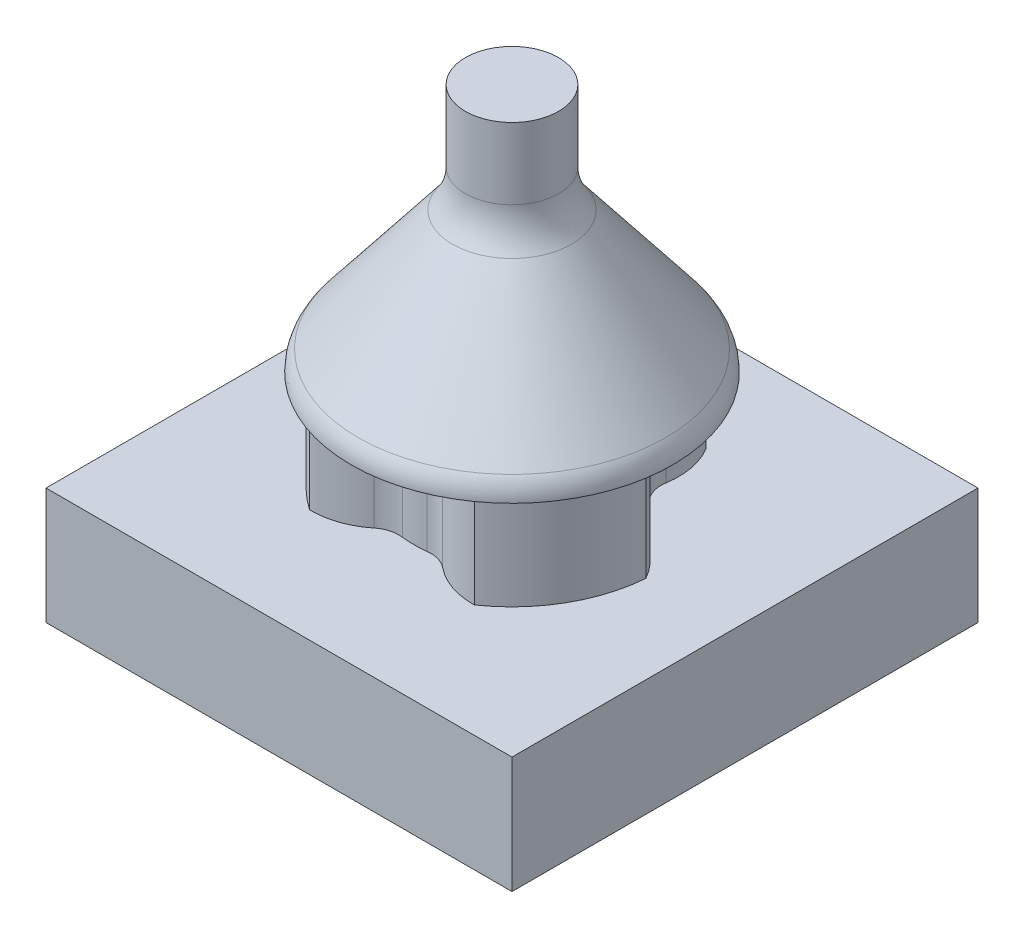
ISO-10303-21;
HEADER;
FILE_DESCRIPTION(('STEP AP214'),'2;1');
FILE_NAME('part.step','',(''),(''),'','','');
FILE_SCHEMA(('AUTOMOTIVE_DESIGN { 1 0 10303 214 1 1 1 1 }'));
ENDSEC;
DATA;
#1=APPLICATION_CONTEXT('core data for automotive mechanical design processes');
#2=APPLICATION_PROTOCOL_DEFINITION('international standard','automotive_design',2000,#1);
#3=PRODUCT_CONTEXT('',#1,'mechanical');
#4=PRODUCT('Part','Part','',(#3));
#5=PRODUCT_RELATED_PRODUCT_CATEGORY('part','',(#4));
#6=PRODUCT_DEFINITION_FORMATION('','',#4);
#7=PRODUCT_DEFINITION_CONTEXT('part definition',#1,'design');
#8=PRODUCT_DEFINITION('design','',#6,#7);
#9=PRODUCT_DEFINITION_SHAPE('','',#8);
#10=(LENGTH_UNIT() NAMED_UNIT(*) SI_UNIT(.MILLI.,.METRE.));
#11=(NAMED_UNIT(*) PLANE_ANGLE_UNIT() SI_UNIT($,.RADIAN.));
#12=(NAMED_UNIT(*) SI_UNIT($,.STERADIAN.) SOLID_ANGLE_UNIT());
#13=UNCERTAINTY_MEASURE_WITH_UNIT(LENGTH_MEASURE(1.E-05),#10,'distance_accuracy_value','');
#14=(GEOMETRIC_REPRESENTATION_CONTEXT(3) GLOBAL_UNCERTAINTY_ASSIGNED_CONTEXT((#13)) GLOBAL_UNIT_ASSIGNED_CONTEXT((#10,
#11,#12)) REPRESENTATION_CONTEXT('',''));
#15=CARTESIAN_POINT('',(0.,0.,0.));
#16=DIRECTION('',(0.,0.,1.));
#17=DIRECTION('',(1.,0.,0.));
#18=AXIS2_PLACEMENT_3D('',#15,#16,#17);
#19=CARTESIAN_POINT('',(0.,0.,0.));
#20=DIRECTION('',(0.,-1.,0.));
#21=DIRECTION('',(0.,0.,-1.));
#22=AXIS2_PLACEMENT_3D('',#19,#20,#21);
#23=PLANE('',#22);
#24=DIRECTION('',(0.,0.,1.));
#25=VECTOR('',#24,1.);
#26=CARTESIAN_POINT('',(50.8,0.,50.8));
#27=LINE('',#26,#25);
#28=CARTESIAN_POINT('',(50.8,0.,-50.8));
#29=VERTEX_POINT('',#28);
#30=CARTESIAN_POINT('',(50.8,0.,50.8));
#31=VERTEX_POINT('',#30);
#32=EDGE_CURVE('E225',#29,#31,#27,.T.);
#33=ORIENTED_EDGE('',*,*,#32,.F.);
#34=DIRECTION('',(1.,0.,0.));
#35=VECTOR('',#34,1.);
#36=CARTESIAN_POINT('',(-50.8,0.,-50.8));
#37=LINE('',#36,#35);
#38=CARTESIAN_POINT('',(-50.8,0.,-50.8));
#39=VERTEX_POINT('',#38);
#40=EDGE_CURVE('E84',#39,#29,#37,.T.);
#41=ORIENTED_EDGE('',*,*,#40,.F.);
#42=DIRECTION('',(0.,0.,-1.));
#43=VECTOR('',#42,1.);
#44=CARTESIAN_POINT('',(-50.8,0.,50.8));
#45=LINE('',#44,#43);
#46=CARTESIAN_POINT('',(-50.8,0.,50.8));
#47=VERTEX_POINT('',#46);
#48=EDGE_CURVE('E245',#47,#39,#45,.T.);
#49=ORIENTED_EDGE('',*,*,#48,.F.);
#50=DIRECTION('',(-1.,0.,0.));
#51=VECTOR('',#50,1.);
#52=CARTESIAN_POINT('',(-50.8,0.,50.8));
#53=LINE('',#52,#51);
#54=EDGE_CURVE('E243',#31,#47,#53,.T.);
#55=ORIENTED_EDGE('',*,*,#54,.F.);
#56=EDGE_LOOP('',(#33,#41,#49,#55));
#57=FACE_BOUND('',#56,.T.);
#58=CARTESIAN_POINT('',(22.0966045355212,0.,-16.7861495957476));
#59=DIRECTION('',(0.,1.,0.));
#60=DIRECTION('',(0.,0.,-1.));
#61=AXIS2_PLACEMENT_3D('',#58,#59,#60);
#62=CIRCLE('',#61,6.34999999999998);
#63=CARTESIAN_POINT('',(15.8262854273046,0.,-17.7889448296479));
#64=VERTEX_POINT('',#63);
#65=CARTESIAN_POINT('',(17.0401732916945,0.,-12.9449254319617));
#66=VERTEX_POINT('',#65);
#67=EDGE_CURVE('E423',#64,#66,#62,.T.);
#68=ORIENTED_EDGE('',*,*,#67,.T.);
#69=CARTESIAN_POINT('',(-1.70002900645727E-12,0.,-3.30291349825984E-12));
#70=DIRECTION('',(0.,-1.,0.));
#71=DIRECTION('',(0.,0.,-1.));
#72=AXIS2_PLACEMENT_3D('',#69,#70,#71);
#73=CIRCLE('',#72,21.3995);
#74=CARTESIAN_POINT('',(19.730720920134,0.,-8.28476023924504));
#75=VERTEX_POINT('',#74);
#76=EDGE_CURVE('E54',#66,#75,#73,.T.);
#77=ORIENTED_EDGE('',*,*,#76,.T.);
#78=CARTESIAN_POINT('',(25.5855342495534,0.,-10.7431460669077));
#79=DIRECTION('',(0.,1.,0.));
#80=DIRECTION('',(0.,0.,-1.));
#81=AXIS2_PLACEMENT_3D('',#78,#79,#80);
#82=CIRCLE('',#81,6.35);
#83=CARTESIAN_POINT('',(23.3188208427071,0.,-4.81149281244122));
#84=VERTEX_POINT('',#83);
#85=EDGE_CURVE('E223',#75,#84,#82,.T.);
#86=ORIENTED_EDGE('',*,*,#85,.T.);
#87=CARTESIAN_POINT('',(17.5976362038528,0.,10.1600000018194));
#88=DIRECTION('',(0.,-1.,0.));
#89=DIRECTION('',(0.,0.,-1.));
#90=AXIS2_PLACEMENT_3D('',#87,#88,#89);
#91=CIRCLE('',#90,16.0273999999788);
#92=CARTESIAN_POINT('',(31.6545140455146,0.,2.46053663714801));
#93=VERTEX_POINT('',#92);
#94=EDGE_CURVE('E209',#84,#93,#91,.T.);
#95=ORIENTED_EDGE('',*,*,#94,.T.);
#96=CARTESIAN_POINT('',(0.,0.,0.));
#97=DIRECTION('',(0.,-1.,0.));
#98=DIRECTION('',(0.,0.,-1.));
#99=AXIS2_PLACEMENT_3D('',#96,#97,#98);
#100=CIRCLE('',#99,31.7500000000067);
#101=CARTESIAN_POINT('',(17.9581442520505,0.,26.1833449930098));
#102=VERTEX_POINT('',#101);
#103=EDGE_CURVE('E197',#93,#102,#100,.T.);
#104=ORIENTED_EDGE('',*,*,#103,.T.);
#105=CARTESIAN_POINT('',(17.5976362038631,0.,10.1600000018254));
#106=DIRECTION('',(0.,-1.,0.));
#107=DIRECTION('',(0.,0.,-1.));
#108=AXIS2_PLACEMENT_3D('',#105,#106,#107);
#109=CIRCLE('',#108,16.0273999999789);
#110=CARTESIAN_POINT('',(7.49253541099745,0.,22.6004376438599));
#111=VERTEX_POINT('',#110);
#112=EDGE_CURVE('E210',#102,#111,#109,.T.);
#113=ORIENTED_EDGE('',*,*,#112,.T.);
#114=CARTESIAN_POINT('',(3.48892970858898,0.,27.5292956636899));
#115=DIRECTION('',(0.,1.,0.));
#116=DIRECTION('',(0.,0.,-1.));
#117=AXIS2_PLACEMENT_3D('',#114,#115,#116);
#118=CIRCLE('',#117,6.35000000000004);
#119=CARTESIAN_POINT('',(2.69054762424453,0.,21.2296856720001));
#120=VERTEX_POINT('',#119);
#121=EDGE_CURVE('E458',#111,#120,#118,.T.);
#122=ORIENTED_EDGE('',*,*,#121,.T.);
#123=CARTESIAN_POINT('',(3.73312492030209E-12,0.,5.52335954751015E-12));
#124=DIRECTION('',(0.,-1.,0.));
#125=DIRECTION('',(0.,0.,-1.));
#126=AXIS2_PLACEMENT_3D('',#123,#124,#125);
#127=CIRCLE('',#126,21.3995);
#128=CARTESIAN_POINT('',(-2.69054762763091,0.,21.22968567157));
#129=VERTEX_POINT('',#128);
#130=EDGE_CURVE('E455',#120,#129,#127,.T.);
#131=ORIENTED_EDGE('',*,*,#130,.T.);
#132=CARTESIAN_POINT('',(-3.48892971298245,0.,27.5292956631322));
#133=DIRECTION('',(0.,1.,0.));
#134=DIRECTION('',(0.,0.,-1.));
#135=AXIS2_PLACEMENT_3D('',#132,#133,#134);
#136=CIRCLE('',#135,6.35000000000002);
#137=CARTESIAN_POINT('',(-7.49253541461107,0.,22.6004376426687));
#138=VERTEX_POINT('',#137);
#139=EDGE_CURVE('E452',#129,#138,#136,.T.);
#140=ORIENTED_EDGE('',*,*,#139,.T.);
#141=CARTESIAN_POINT('',(-17.5976362053638,0.,10.1599999992132));
#142=DIRECTION('',(0.,-1.,0.));
#143=DIRECTION('',(0.,0.,-1.));
#144=AXIS2_PLACEMENT_3D('',#141,#142,#143);
#145=CIRCLE('',#144,16.0273999997497);
#146=CARTESIAN_POINT('',(-17.9581442562873,0.,26.1833449901068));
#147=VERTEX_POINT('',#146);
#148=EDGE_CURVE('E449',#138,#147,#145,.T.);
#149=ORIENTED_EDGE('',*,*,#148,.T.);
#150=CARTESIAN_POINT('',(1.76594849854439E-12,0.,8.46545056276682E-12));
#151=DIRECTION('',(0.,-1.,0.));
#152=DIRECTION('',(0.,0.,-1.));
#153=AXIS2_PLACEMENT_3D('',#150,#151,#152);
#154=CIRCLE('',#153,31.7500000000031);
#155=CARTESIAN_POINT('',(-31.6545140458436,0.,2.46053663285388));
#156=VERTEX_POINT('',#155);
#157=EDGE_CURVE('E446',#147,#156,#154,.T.);
#158=ORIENTED_EDGE('',*,*,#157,.T.);
#159=CARTESIAN_POINT('',(-17.5976362053693,0.,10.1599999992164));
#160=DIRECTION('',(0.,-1.,0.));
#161=DIRECTION('',(0.,0.,-1.));
#162=AXIS2_PLACEMENT_3D('',#159,#160,#161);
#163=CIRCLE('',#162,16.0273999997497);
#164=CARTESIAN_POINT('',(-23.3188208420658,0.,-4.81149281562363));
#165=VERTEX_POINT('',#164);
#166=EDGE_CURVE('E443',#156,#165,#163,.T.);
#167=ORIENTED_EDGE('',*,*,#166,.T.);
#168=CARTESIAN_POINT('',(-25.5855342480823,0.,-10.7431460704072));
#169=DIRECTION('',(0.,1.,0.));
#170=DIRECTION('',(0.,0.,-1.));
#171=AXIS2_PLACEMENT_3D('',#168,#169,#170);
#172=CIRCLE('',#171,6.34999999999997);
#173=CARTESIAN_POINT('',(-19.7307209190021,0.,-8.28476024193675));
#174=VERTEX_POINT('',#173);
#175=EDGE_CURVE('E440',#165,#174,#172,.T.);
#176=ORIENTED_EDGE('',*,*,#175,.T.);
#177=CARTESIAN_POINT('',(-1.70696790036118E-12,0.,8.71525074330748E-12));
#178=DIRECTION('',(0.,-1.,0.));
#179=DIRECTION('',(0.,0.,-1.));
#180=AXIS2_PLACEMENT_3D('',#177,#178,#179);
#181=CIRCLE('',#180,21.3995);
#182=CARTESIAN_POINT('',(-17.0401732940327,0.,-12.9449254288762));
#183=VERTEX_POINT('',#182);
#184=EDGE_CURVE('E437',#174,#183,#181,.T.);
#185=ORIENTED_EDGE('',*,*,#184,.T.);
#186=CARTESIAN_POINT('',(-22.0966045385524,0.,-16.7861495917501));
#187=DIRECTION('',(0.,1.,0.));
#188=DIRECTION('',(0.,0.,-1.));
#189=AXIS2_PLACEMENT_3D('',#186,#187,#188);
#190=CIRCLE('',#189,6.35000000000002);
#191=CARTESIAN_POINT('',(-15.8262854305166,0.,-17.7889448267813));
#192=VERTEX_POINT('',#191);
#193=EDGE_CURVE('E434',#183,#192,#190,.T.);
#194=ORIENTED_EDGE('',*,*,#193,.T.);
#195=CARTESIAN_POINT('',(-1.83426884792226E-09,0.,-20.3200000000002));
#196=DIRECTION('',(0.,-1.,0.));
#197=DIRECTION('',(0.,0.,-1.));
#198=AXIS2_PLACEMENT_3D('',#195,#196,#197);
#199=CIRCLE('',#198,16.0274);
#200=CARTESIAN_POINT('',(-13.6963697936226,0.,-28.6438816237733));
#201=VERTEX_POINT('',#200);
#202=EDGE_CURVE('E431',#192,#201,#199,.T.);
#203=ORIENTED_EDGE('',*,*,#202,.T.);
#204=CARTESIAN_POINT('',(-4.57966997657877E-12,0.,2.72004641033163E-12));
#205=DIRECTION('',(0.,-1.,0.));
#206=DIRECTION('',(0.,0.,-1.));
#207=AXIS2_PLACEMENT_3D('',#204,#205,#206);
#208=CIRCLE('',#207,31.7500000000067);
#209=CARTESIAN_POINT('',(13.6963697884654,0.,-28.6438816262349));
#210=VERTEX_POINT('',#209);
#211=EDGE_CURVE('E428',#201,#210,#208,.T.);
#212=ORIENTED_EDGE('',*,*,#211,.T.);
#213=CARTESIAN_POINT('',(-1.83426537847531E-09,0.,-20.3200000000122));
#214=DIRECTION('',(0.,-1.,0.));
#215=DIRECTION('',(0.,0.,-1.));
#216=AXIS2_PLACEMENT_3D('',#213,#214,#215);
#217=CIRCLE('',#216,16.0274);
#218=EDGE_CURVE('E425',#210,#64,#217,.T.);
#219=ORIENTED_EDGE('',*,*,#218,.T.);
#220=EDGE_LOOP('',(#68,#77,#86,#95,#104,#113,#122,#131,#140,#149,#158,#167,#176,#185,#194,#203,
#212,#219));
#221=FACE_BOUND('',#220,.T.);
#222=ADVANCED_FACE('F39',(#57,#221),#23,.F.);
#223=CARTESIAN_POINT('',(50.8,-25.4,50.8));
#224=DIRECTION('',(-1.,0.,0.));
#225=DIRECTION('',(0.,0.,1.));
#226=AXIS2_PLACEMENT_3D('',#223,#224,#225);
#227=PLANE('',#226);
#228=ORIENTED_EDGE('',*,*,#32,.T.);
#229=DIRECTION('',(0.,1.,0.));
#230=VECTOR('',#229,1.);
#231=CARTESIAN_POINT('',(50.8,-25.4,50.8));
#232=LINE('',#231,#230);
#233=CARTESIAN_POINT('',(50.8,-25.4,50.8));
#234=VERTEX_POINT('',#233);
#235=EDGE_CURVE('E11',#234,#31,#232,.T.);
#236=ORIENTED_EDGE('',*,*,#235,.F.);
#237=DIRECTION('',(0.,0.,1.));
#238=VECTOR('',#237,1.);
#239=CARTESIAN_POINT('',(50.8,-25.4,50.8));
#240=LINE('',#239,#238);
#241=CARTESIAN_POINT('',(50.8,-25.4,-50.8));
#242=VERTEX_POINT('',#241);
#243=EDGE_CURVE('E234',#242,#234,#240,.T.);
#244=ORIENTED_EDGE('',*,*,#243,.F.);
#245=DIRECTION('',(0.,1.,0.));
#246=VECTOR('',#245,1.);
#247=CARTESIAN_POINT('',(50.8,-25.4,-50.8));
#248=LINE('',#247,#246);
#249=EDGE_CURVE('E240',#242,#29,#248,.T.);
#250=ORIENTED_EDGE('',*,*,#249,.T.);
#251=EDGE_LOOP('',(#228,#236,#244,#250));
#252=FACE_BOUND('',#251,.T.);
#253=ADVANCED_FACE('F41',(#252),#227,.F.);
#254=CARTESIAN_POINT('',(-50.8,-25.4,50.8));
#255=DIRECTION('',(0.,0.,-1.));
#256=DIRECTION('',(-1.,0.,0.));
#257=AXIS2_PLACEMENT_3D('',#254,#255,#256);
#258=PLANE('',#257);
#259=ORIENTED_EDGE('',*,*,#54,.T.);
#260=DIRECTION('',(0.,1.,0.));
#261=VECTOR('',#260,1.);
#262=CARTESIAN_POINT('',(-50.8,-25.4,50.8));
#263=LINE('',#262,#261);
#264=CARTESIAN_POINT('',(-50.8,-25.4,50.8));
#265=VERTEX_POINT('',#264);
#266=EDGE_CURVE('E47',#265,#47,#263,.T.);
#267=ORIENTED_EDGE('',*,*,#266,.F.);
#268=DIRECTION('',(-1.,0.,0.));
#269=VECTOR('',#268,1.);
#270=CARTESIAN_POINT('',(-50.8,-25.4,50.8));
#271=LINE('',#270,#269);
#272=EDGE_CURVE('E91',#234,#265,#271,.T.);
#273=ORIENTED_EDGE('',*,*,#272,.F.);
#274=ORIENTED_EDGE('',*,*,#235,.T.);
#275=EDGE_LOOP('',(#259,#267,#273,#274));
#276=FACE_BOUND('',#275,.T.);
#277=ADVANCED_FACE('F272',(#276),#258,.F.);
#278=CARTESIAN_POINT('',(-50.8,-25.4,50.8));
#279=DIRECTION('',(1.,0.,0.));
#280=DIRECTION('',(0.,0.,-1.));
#281=AXIS2_PLACEMENT_3D('',#278,#279,#280);
#282=PLANE('',#281);
#283=ORIENTED_EDGE('',*,*,#48,.T.);
#284=DIRECTION('',(0.,1.,0.));
#285=VECTOR('',#284,1.);
#286=CARTESIAN_POINT('',(-50.8,-25.4,-50.8));
#287=LINE('',#286,#285);
#288=CARTESIAN_POINT('',(-50.8,-25.4,-50.8));
#289=VERTEX_POINT('',#288);
#290=EDGE_CURVE('E249',#289,#39,#287,.T.);
#291=ORIENTED_EDGE('',*,*,#290,.F.);
#292=DIRECTION('',(0.,0.,-1.));
#293=VECTOR('',#292,1.);
#294=CARTESIAN_POINT('',(-50.8,-25.4,50.8));
#295=LINE('',#294,#293);
#296=EDGE_CURVE('E237',#265,#289,#295,.T.);
#297=ORIENTED_EDGE('',*,*,#296,.F.);
#298=ORIENTED_EDGE('',*,*,#266,.T.);
#299=EDGE_LOOP('',(#283,#291,#297,#298));
#300=FACE_BOUND('',#299,.T.);
#301=ADVANCED_FACE('F254',(#300),#282,.F.);
#302=CARTESIAN_POINT('',(-50.8,-25.4,-50.8));
#303=DIRECTION('',(0.,0.,1.));
#304=DIRECTION('',(1.,0.,0.));
#305=AXIS2_PLACEMENT_3D('',#302,#303,#304);
#306=PLANE('',#305);
#307=ORIENTED_EDGE('',*,*,#40,.T.);
#308=ORIENTED_EDGE('',*,*,#249,.F.);
#309=DIRECTION('',(1.,0.,0.));
#310=VECTOR('',#309,1.);
#311=CARTESIAN_POINT('',(-50.8,-25.4,-50.8));
#312=LINE('',#311,#310);
#313=EDGE_CURVE('E63',#289,#242,#312,.T.);
#314=ORIENTED_EDGE('',*,*,#313,.F.);
#315=ORIENTED_EDGE('',*,*,#290,.T.);
#316=EDGE_LOOP('',(#307,#308,#314,#315));
#317=FACE_BOUND('',#316,.T.);
#318=ADVANCED_FACE('F261',(#317),#306,.F.);
#319=CARTESIAN_POINT('',(0.,-25.4,0.));
#320=DIRECTION('',(0.,-1.,0.));
#321=DIRECTION('',(0.,0.,-1.));
#322=AXIS2_PLACEMENT_3D('',#319,#320,#321);
#323=PLANE('',#322);
#324=ORIENTED_EDGE('',*,*,#243,.T.);
#325=ORIENTED_EDGE('',*,*,#272,.T.);
#326=ORIENTED_EDGE('',*,*,#296,.T.);
#327=ORIENTED_EDGE('',*,*,#313,.T.);
#328=EDGE_LOOP('',(#324,#325,#326,#327));
#329=FACE_BOUND('',#328,.T.);
#330=ADVANCED_FACE('F263',(#329),#323,.T.);
#331=CARTESIAN_POINT('',(0.,76.2,0.));
#332=DIRECTION('',(0.,1.,0.));
#333=DIRECTION('',(0.,0.,1.));
#334=AXIS2_PLACEMENT_3D('',#331,#332,#333);
#335=PLANE('',#334);
#336=CARTESIAN_POINT('',(0.,76.2,0.));
#337=DIRECTION('',(0.,1.,0.));
#338=DIRECTION('',(0.,0.,1.));
#339=AXIS2_PLACEMENT_3D('',#336,#337,#338);
#340=CIRCLE('',#339,10.16);
#341=CARTESIAN_POINT('',(0.,76.2,10.16));
#342=VERTEX_POINT('',#341);
#343=EDGE_CURVE('E229',#342,#342,#340,.T.);
#344=ORIENTED_EDGE('',*,*,#343,.T.);
#345=EDGE_LOOP('',(#344));
#346=FACE_BOUND('',#345,.T.);
#347=ADVANCED_FACE('F269',(#346),#335,.T.);
#348=CARTESIAN_POINT('',(22.0966045355212,25.4,-16.7861495957476));
#349=DIRECTION('',(0.,-1.,0.));
#350=DIRECTION('',(0.,0.,-1.));
#351=AXIS2_PLACEMENT_3D('',#348,#349,#350);
#352=CYLINDRICAL_SURFACE('',#351,6.34999999999998);
#353=DIRECTION('',(0.,-1.,0.));
#354=VECTOR('',#353,1.);
#355=CARTESIAN_POINT('',(15.8262854273046,25.4,-17.7889448296479));
#356=LINE('',#355,#354);
#357=CARTESIAN_POINT('',(15.8262854273046,21.8920636616788,-17.7889448296479));
#358=VERTEX_POINT('',#357);
#359=EDGE_CURVE('E417',#358,#64,#356,.T.);
#360=ORIENTED_EDGE('',*,*,#359,.F.);
#361=CARTESIAN_POINT('',(22.0966045355212,21.8920636616788,-16.7861495957476));
#362=DIRECTION('',(0.,-1.,0.));
#363=DIRECTION('',(0.,0.,-1.));
#364=AXIS2_PLACEMENT_3D('',#361,#362,#363);
#365=CIRCLE('',#364,6.34999999999998);
#366=CARTESIAN_POINT('',(17.0401732916945,21.8920636616788,-12.9449254319617));
#367=VERTEX_POINT('',#366);
#368=EDGE_CURVE('E509',#358,#367,#365,.F.);
#369=ORIENTED_EDGE('',*,*,#368,.T.);
#370=DIRECTION('',(0.,-1.,0.));
#371=VECTOR('',#370,1.);
#372=CARTESIAN_POINT('',(17.0401732916945,25.4,-12.9449254319617));
#373=LINE('',#372,#371);
#374=EDGE_CURVE('E419',#367,#66,#373,.T.);
#375=ORIENTED_EDGE('',*,*,#374,.T.);
#376=ORIENTED_EDGE('',*,*,#67,.F.);
#377=EDGE_LOOP('',(#360,#369,#375,#376));
#378=FACE_BOUND('',#377,.T.);
#379=ADVANCED_FACE('F271',(#378),#352,.F.);
#380=CARTESIAN_POINT('',(-1.83426537847531E-09,25.4,-20.3200000000122));
#381=DIRECTION('',(0.,-1.,0.));
#382=DIRECTION('',(0.,0.,-1.));
#383=AXIS2_PLACEMENT_3D('',#380,#381,#382);
#384=CYLINDRICAL_SURFACE('',#383,16.0274);
#385=DIRECTION('',(0.,-1.,0.));
#386=VECTOR('',#385,1.);
#387=CARTESIAN_POINT('',(13.6963697884654,25.4,-28.6438816262349));
#388=LINE('',#387,#386);
#389=CARTESIAN_POINT('',(13.6963697884654,21.8920636616788,-28.6438816262349));
#390=VERTEX_POINT('',#389);
#391=EDGE_CURVE('E415',#390,#210,#388,.T.);
#392=ORIENTED_EDGE('',*,*,#391,.F.);
#393=CARTESIAN_POINT('',(-1.83426537847531E-09,21.8920636616788,-20.3200000000122));
#394=DIRECTION('',(0.,-1.,0.));
#395=DIRECTION('',(0.,0.,-1.));
#396=AXIS2_PLACEMENT_3D('',#393,#394,#395);
#397=CIRCLE('',#396,16.0274);
#398=EDGE_CURVE('E507',#390,#358,#397,.T.);
#399=ORIENTED_EDGE('',*,*,#398,.T.);
#400=ORIENTED_EDGE('',*,*,#359,.T.);
#401=ORIENTED_EDGE('',*,*,#218,.F.);
#402=EDGE_LOOP('',(#392,#399,#400,#401));
#403=FACE_BOUND('',#402,.T.);
#404=ADVANCED_FACE('F291',(#403),#384,.T.);
#405=CARTESIAN_POINT('',(-4.57966997657877E-12,25.4,2.72004641033163E-12));
#406=DIRECTION('',(0.,-1.,0.));
#407=DIRECTION('',(0.,0.,-1.));
#408=AXIS2_PLACEMENT_3D('',#405,#406,#407);
#409=CYLINDRICAL_SURFACE('',#408,31.7500000000067);
#410=DIRECTION('',(0.,-1.,0.));
#411=VECTOR('',#410,1.);
#412=CARTESIAN_POINT('',(-13.6963697936226,25.4,-28.6438816237733));
#413=LINE('',#412,#411);
#414=CARTESIAN_POINT('',(-13.6963697936226,21.8920636616788,-28.6438816237733));
#415=VERTEX_POINT('',#414);
#416=EDGE_CURVE('E413',#415,#201,#413,.T.);
#417=ORIENTED_EDGE('',*,*,#416,.F.);
#418=CARTESIAN_POINT('',(-4.57966997657877E-12,21.8920636616788,2.72004641033163E-12));
#419=DIRECTION('',(0.,-1.,0.));
#420=DIRECTION('',(0.,0.,-1.));
#421=AXIS2_PLACEMENT_3D('',#418,#419,#420);
#422=CIRCLE('',#421,31.7500000000067);
#423=EDGE_CURVE('E519',#415,#390,#422,.T.);
#424=ORIENTED_EDGE('',*,*,#423,.T.);
#425=ORIENTED_EDGE('',*,*,#391,.T.);
#426=ORIENTED_EDGE('',*,*,#211,.F.);
#427=EDGE_LOOP('',(#417,#424,#425,#426));
#428=FACE_BOUND('',#427,.T.);
#429=ADVANCED_FACE('F295',(#428),#409,.T.);
#430=CARTESIAN_POINT('',(-1.83426884792226E-09,25.4,-20.3200000000002));
#431=DIRECTION('',(0.,-1.,0.));
#432=DIRECTION('',(0.,0.,-1.));
#433=AXIS2_PLACEMENT_3D('',#430,#431,#432);
#434=CYLINDRICAL_SURFACE('',#433,16.0274);
#435=DIRECTION('',(0.,-1.,0.));
#436=VECTOR('',#435,1.);
#437=CARTESIAN_POINT('',(-15.8262854305166,25.4,-17.7889448267813));
#438=LINE('',#437,#436);
#439=CARTESIAN_POINT('',(-15.8262854305166,21.8920636616788,-17.7889448267813));
#440=VERTEX_POINT('',#439);
#441=EDGE_CURVE('E411',#440,#192,#438,.T.);
#442=ORIENTED_EDGE('',*,*,#441,.F.);
#443=CARTESIAN_POINT('',(-1.83426884792226E-09,21.8920636616788,-20.3200000000002));
#444=DIRECTION('',(0.,-1.,0.));
#445=DIRECTION('',(0.,0.,-1.));
#446=AXIS2_PLACEMENT_3D('',#443,#444,#445);
#447=CIRCLE('',#446,16.0274);
#448=EDGE_CURVE('E500',#440,#415,#447,.T.);
#449=ORIENTED_EDGE('',*,*,#448,.T.);
#450=ORIENTED_EDGE('',*,*,#416,.T.);
#451=ORIENTED_EDGE('',*,*,#202,.F.);
#452=EDGE_LOOP('',(#442,#449,#450,#451));
#453=FACE_BOUND('',#452,.T.);
#454=ADVANCED_FACE('F299',(#453),#434,.T.);
#455=CARTESIAN_POINT('',(-22.0966045385524,25.4,-16.7861495917501));
#456=DIRECTION('',(0.,-1.,0.));
#457=DIRECTION('',(0.,0.,-1.));
#458=AXIS2_PLACEMENT_3D('',#455,#456,#457);
#459=CYLINDRICAL_SURFACE('',#458,6.35000000000002);
#460=DIRECTION('',(0.,-1.,0.));
#461=VECTOR('',#460,1.);
#462=CARTESIAN_POINT('',(-17.0401732940327,25.4,-12.9449254288762));
#463=LINE('',#462,#461);
#464=CARTESIAN_POINT('',(-17.0401732940327,21.8920636616788,-12.9449254288762));
#465=VERTEX_POINT('',#464);
#466=EDGE_CURVE('E409',#465,#183,#463,.T.);
#467=ORIENTED_EDGE('',*,*,#466,.F.);
#468=CARTESIAN_POINT('',(-22.0966045385524,21.8920636616788,-16.7861495917501));
#469=DIRECTION('',(0.,-1.,0.));
#470=DIRECTION('',(0.,0.,-1.));
#471=AXIS2_PLACEMENT_3D('',#468,#469,#470);
#472=CIRCLE('',#471,6.35000000000002);
#473=EDGE_CURVE('E496',#465,#440,#472,.F.);
#474=ORIENTED_EDGE('',*,*,#473,.T.);
#475=ORIENTED_EDGE('',*,*,#441,.T.);
#476=ORIENTED_EDGE('',*,*,#193,.F.);
#477=EDGE_LOOP('',(#467,#474,#475,#476));
#478=FACE_BOUND('',#477,.T.);
#479=ADVANCED_FACE('F303',(#478),#459,.F.);
#480=CARTESIAN_POINT('',(-1.70696790036118E-12,25.4,8.71525074330748E-12));
#481=DIRECTION('',(0.,-1.,0.));
#482=DIRECTION('',(0.,0.,-1.));
#483=AXIS2_PLACEMENT_3D('',#480,#481,#482);
#484=CYLINDRICAL_SURFACE('',#483,21.3995);
#485=DIRECTION('',(0.,-1.,0.));
#486=VECTOR('',#485,1.);
#487=CARTESIAN_POINT('',(-19.7307209190021,25.4,-8.28476024193675));
#488=LINE('',#487,#486);
#489=CARTESIAN_POINT('',(-19.7307209190021,21.8920636616788,-8.28476024193675));
#490=VERTEX_POINT('',#489);
#491=EDGE_CURVE('E407',#490,#174,#488,.T.);
#492=ORIENTED_EDGE('',*,*,#491,.F.);
#493=CARTESIAN_POINT('',(-1.70696790036118E-12,21.8920636616788,8.71525074330748E-12));
#494=DIRECTION('',(0.,-1.,0.));
#495=DIRECTION('',(0.,0.,-1.));
#496=AXIS2_PLACEMENT_3D('',#493,#494,#495);
#497=CIRCLE('',#496,21.3995);
#498=EDGE_CURVE('E523',#490,#465,#497,.T.);
#499=ORIENTED_EDGE('',*,*,#498,.T.);
#500=ORIENTED_EDGE('',*,*,#466,.T.);
#501=ORIENTED_EDGE('',*,*,#184,.F.);
#502=EDGE_LOOP('',(#492,#499,#500,#501));
#503=FACE_BOUND('',#502,.T.);
#504=ADVANCED_FACE('F307',(#503),#484,.T.);
#505=CARTESIAN_POINT('',(-25.5855342480823,25.4,-10.7431460704072));
#506=DIRECTION('',(0.,-1.,0.));
#507=DIRECTION('',(0.,0.,-1.));
#508=AXIS2_PLACEMENT_3D('',#505,#506,#507);
#509=CYLINDRICAL_SURFACE('',#508,6.34999999999997);
#510=DIRECTION('',(0.,-1.,0.));
#511=VECTOR('',#510,1.);
#512=CARTESIAN_POINT('',(-23.3188208420658,25.4,-4.81149281562363));
#513=LINE('',#512,#511);
#514=CARTESIAN_POINT('',(-23.3188208420658,21.8920636616788,-4.81149281562363));
#515=VERTEX_POINT('',#514);
#516=EDGE_CURVE('E405',#515,#165,#513,.T.);
#517=ORIENTED_EDGE('',*,*,#516,.F.);
#518=CARTESIAN_POINT('',(-25.5855342480823,21.8920636616788,-10.7431460704072));
#519=DIRECTION('',(0.,-1.,0.));
#520=DIRECTION('',(0.,0.,-1.));
#521=AXIS2_PLACEMENT_3D('',#518,#519,#520);
#522=CIRCLE('',#521,6.34999999999997);
#523=EDGE_CURVE('E489',#515,#490,#522,.F.);
#524=ORIENTED_EDGE('',*,*,#523,.T.);
#525=ORIENTED_EDGE('',*,*,#491,.T.);
#526=ORIENTED_EDGE('',*,*,#175,.F.);
#527=EDGE_LOOP('',(#517,#524,#525,#526));
#528=FACE_BOUND('',#527,.T.);
#529=ADVANCED_FACE('F311',(#528),#509,.F.);
#530=CARTESIAN_POINT('',(-17.5976362053693,25.4,10.1599999992164));
#531=DIRECTION('',(0.,-1.,0.));
#532=DIRECTION('',(0.,0.,-1.));
#533=AXIS2_PLACEMENT_3D('',#530,#531,#532);
#534=CYLINDRICAL_SURFACE('',#533,16.0273999997497);
#535=DIRECTION('',(0.,-1.,0.));
#536=VECTOR('',#535,1.);
#537=CARTESIAN_POINT('',(-31.6545140458436,25.4,2.46053663285388));
#538=LINE('',#537,#536);
#539=CARTESIAN_POINT('',(-31.6545140458436,21.8920636616788,2.46053663285388));
#540=VERTEX_POINT('',#539);
#541=EDGE_CURVE('E403',#540,#156,#538,.T.);
#542=ORIENTED_EDGE('',*,*,#541,.F.);
#543=CARTESIAN_POINT('',(-17.5976362053693,21.8920636616788,10.1599999992164));
#544=DIRECTION('',(0.,-1.,0.));
#545=DIRECTION('',(0.,0.,-1.));
#546=AXIS2_PLACEMENT_3D('',#543,#544,#545);
#547=CIRCLE('',#546,16.0273999997497);
#548=EDGE_CURVE('E485',#540,#515,#547,.T.);
#549=ORIENTED_EDGE('',*,*,#548,.T.);
#550=ORIENTED_EDGE('',*,*,#516,.T.);
#551=ORIENTED_EDGE('',*,*,#166,.F.);
#552=EDGE_LOOP('',(#542,#549,#550,#551));
#553=FACE_BOUND('',#552,.T.);
#554=ADVANCED_FACE('F315',(#553),#534,.T.);
#555=CARTESIAN_POINT('',(1.76594849854439E-12,25.4,8.46545056276682E-12));
#556=DIRECTION('',(0.,-1.,0.));
#557=DIRECTION('',(0.,0.,-1.));
#558=AXIS2_PLACEMENT_3D('',#555,#556,#557);
#559=CYLINDRICAL_SURFACE('',#558,31.7500000000031);
#560=DIRECTION('',(0.,-1.,0.));
#561=VECTOR('',#560,1.);
#562=CARTESIAN_POINT('',(-17.9581442562873,25.4,26.1833449901068));
#563=LINE('',#562,#561);
#564=CARTESIAN_POINT('',(-17.9581442562873,21.8920636616788,26.1833449901068));
#565=VERTEX_POINT('',#564);
#566=EDGE_CURVE('E401',#565,#147,#563,.T.);
#567=ORIENTED_EDGE('',*,*,#566,.F.);
#568=CARTESIAN_POINT('',(1.76594849854439E-12,21.8920636616788,8.46545056276682E-12));
#569=DIRECTION('',(0.,-1.,0.));
#570=DIRECTION('',(0.,0.,-1.));
#571=AXIS2_PLACEMENT_3D('',#568,#569,#570);
#572=CIRCLE('',#571,31.7500000000031);
#573=EDGE_CURVE('E527',#565,#540,#572,.T.);
#574=ORIENTED_EDGE('',*,*,#573,.T.);
#575=ORIENTED_EDGE('',*,*,#541,.T.);
#576=ORIENTED_EDGE('',*,*,#157,.F.);
#577=EDGE_LOOP('',(#567,#574,#575,#576));
#578=FACE_BOUND('',#577,.T.);
#579=ADVANCED_FACE('F319',(#578),#559,.T.);
#580=CARTESIAN_POINT('',(-17.5976362053638,25.4,10.1599999992132));
#581=DIRECTION('',(0.,-1.,0.));
#582=DIRECTION('',(0.,0.,-1.));
#583=AXIS2_PLACEMENT_3D('',#580,#581,#582);
#584=CYLINDRICAL_SURFACE('',#583,16.0273999997497);
#585=DIRECTION('',(0.,-1.,0.));
#586=VECTOR('',#585,1.);
#587=CARTESIAN_POINT('',(-7.49253541461107,25.4,22.6004376426687));
#588=LINE('',#587,#586);
#589=CARTESIAN_POINT('',(-7.49253541461107,21.8920636616788,22.6004376426687));
#590=VERTEX_POINT('',#589);
#591=EDGE_CURVE('E399',#590,#138,#588,.T.);
#592=ORIENTED_EDGE('',*,*,#591,.F.);
#593=CARTESIAN_POINT('',(-17.5976362053638,21.8920636616788,10.1599999992132));
#594=DIRECTION('',(0.,-1.,0.));
#595=DIRECTION('',(0.,0.,-1.));
#596=AXIS2_PLACEMENT_3D('',#593,#594,#595);
#597=CIRCLE('',#596,16.0273999997497);
#598=EDGE_CURVE('E478',#590,#565,#597,.T.);
#599=ORIENTED_EDGE('',*,*,#598,.T.);
#600=ORIENTED_EDGE('',*,*,#566,.T.);
#601=ORIENTED_EDGE('',*,*,#148,.F.);
#602=EDGE_LOOP('',(#592,#599,#600,#601));
#603=FACE_BOUND('',#602,.T.);
#604=ADVANCED_FACE('F323',(#603),#584,.T.);
#605=CARTESIAN_POINT('',(-3.48892971298245,25.4,27.5292956631322));
#606=DIRECTION('',(0.,-1.,0.));
#607=DIRECTION('',(0.,0.,-1.));
#608=AXIS2_PLACEMENT_3D('',#605,#606,#607);
#609=CYLINDRICAL_SURFACE('',#608,6.35000000000002);
#610=DIRECTION('',(0.,-1.,0.));
#611=VECTOR('',#610,1.);
#612=CARTESIAN_POINT('',(-2.69054762763091,25.4,21.22968567157));
#613=LINE('',#612,#611);
#614=CARTESIAN_POINT('',(-2.69054762763091,21.8920636616788,21.22968567157));
#615=VERTEX_POINT('',#614);
#616=EDGE_CURVE('E397',#615,#129,#613,.T.);
#617=ORIENTED_EDGE('',*,*,#616,.F.);
#618=CARTESIAN_POINT('',(-3.48892971298245,21.8920636616788,27.5292956631322));
#619=DIRECTION('',(0.,-1.,0.));
#620=DIRECTION('',(0.,0.,-1.));
#621=AXIS2_PLACEMENT_3D('',#618,#619,#620);
#622=CIRCLE('',#621,6.35000000000002);
#623=EDGE_CURVE('E474',#615,#590,#622,.F.);
#624=ORIENTED_EDGE('',*,*,#623,.T.);
#625=ORIENTED_EDGE('',*,*,#591,.T.);
#626=ORIENTED_EDGE('',*,*,#139,.F.);
#627=EDGE_LOOP('',(#617,#624,#625,#626));
#628=FACE_BOUND('',#627,.T.);
#629=ADVANCED_FACE('F327',(#628),#609,.F.);
#630=CARTESIAN_POINT('',(3.73312492030209E-12,25.4,5.52335954751015E-12));
#631=DIRECTION('',(0.,-1.,0.));
#632=DIRECTION('',(0.,0.,-1.));
#633=AXIS2_PLACEMENT_3D('',#630,#631,#632);
#634=CYLINDRICAL_SURFACE('',#633,21.3995);
#635=DIRECTION('',(0.,-1.,0.));
#636=VECTOR('',#635,1.);
#637=CARTESIAN_POINT('',(2.69054762424453,25.4,21.2296856720001));
#638=LINE('',#637,#636);
#639=CARTESIAN_POINT('',(2.69054762424453,21.8920636616788,21.2296856720001));
#640=VERTEX_POINT('',#639);
#641=EDGE_CURVE('E395',#640,#120,#638,.T.);
#642=ORIENTED_EDGE('',*,*,#641,.F.);
#643=CARTESIAN_POINT('',(3.73312492030209E-12,21.8920636616788,5.52335954751015E-12));
#644=DIRECTION('',(0.,-1.,0.));
#645=DIRECTION('',(0.,0.,-1.));
#646=AXIS2_PLACEMENT_3D('',#643,#644,#645);
#647=CIRCLE('',#646,21.3995);
#648=EDGE_CURVE('E531',#640,#615,#647,.T.);
#649=ORIENTED_EDGE('',*,*,#648,.T.);
#650=ORIENTED_EDGE('',*,*,#616,.T.);
#651=ORIENTED_EDGE('',*,*,#130,.F.);
#652=EDGE_LOOP('',(#642,#649,#650,#651));
#653=FACE_BOUND('',#652,.T.);
#654=ADVANCED_FACE('F331',(#653),#634,.T.);
#655=CARTESIAN_POINT('',(3.48892970858898,25.4,27.5292956636899));
#656=DIRECTION('',(0.,-1.,0.));
#657=DIRECTION('',(0.,0.,-1.));
#658=AXIS2_PLACEMENT_3D('',#655,#656,#657);
#659=CYLINDRICAL_SURFACE('',#658,6.35000000000004);
#660=DIRECTION('',(0.,-1.,0.));
#661=VECTOR('',#660,1.);
#662=CARTESIAN_POINT('',(7.49253541099745,25.4,22.6004376438599));
#663=LINE('',#662,#661);
#664=CARTESIAN_POINT('',(7.49253541099745,21.8920636616788,22.6004376438599));
#665=VERTEX_POINT('',#664);
#666=EDGE_CURVE('E393',#665,#111,#663,.T.);
#667=ORIENTED_EDGE('',*,*,#666,.F.);
#668=CARTESIAN_POINT('',(3.48892970858898,21.8920636616788,27.5292956636899));
#669=DIRECTION('',(0.,-1.,0.));
#670=DIRECTION('',(0.,0.,-1.));
#671=AXIS2_PLACEMENT_3D('',#668,#669,#670);
#672=CIRCLE('',#671,6.35000000000004);
#673=EDGE_CURVE('E467',#665,#640,#672,.F.);
#674=ORIENTED_EDGE('',*,*,#673,.T.);
#675=ORIENTED_EDGE('',*,*,#641,.T.);
#676=ORIENTED_EDGE('',*,*,#121,.F.);
#677=EDGE_LOOP('',(#667,#674,#675,#676));
#678=FACE_BOUND('',#677,.T.);
#679=ADVANCED_FACE('F335',(#678),#659,.F.);
#680=CARTESIAN_POINT('',(17.5976362038631,25.4,10.1600000018254));
#681=DIRECTION('',(0.,-1.,0.));
#682=DIRECTION('',(0.,0.,-1.));
#683=AXIS2_PLACEMENT_3D('',#680,#681,#682);
#684=CYLINDRICAL_SURFACE('',#683,16.0273999999789);
#685=DIRECTION('',(0.,-1.,0.));
#686=VECTOR('',#685,1.);
#687=CARTESIAN_POINT('',(17.9581442520505,25.4,26.1833449930098));
#688=LINE('',#687,#686);
#689=CARTESIAN_POINT('',(17.9581442520505,21.8920636616788,26.1833449930098));
#690=VERTEX_POINT('',#689);
#691=EDGE_CURVE('E204',#690,#102,#688,.T.);
#692=ORIENTED_EDGE('',*,*,#691,.F.);
#693=CARTESIAN_POINT('',(17.5976362038631,21.8920636616788,10.1600000018254));
#694=DIRECTION('',(0.,-1.,0.));
#695=DIRECTION('',(0.,0.,-1.));
#696=AXIS2_PLACEMENT_3D('',#693,#694,#695);
#697=CIRCLE('',#696,16.0273999999789);
#698=EDGE_CURVE('E463',#690,#665,#697,.T.);
#699=ORIENTED_EDGE('',*,*,#698,.T.);
#700=ORIENTED_EDGE('',*,*,#666,.T.);
#701=ORIENTED_EDGE('',*,*,#112,.F.);
#702=EDGE_LOOP('',(#692,#699,#700,#701));
#703=FACE_BOUND('',#702,.T.);
#704=ADVANCED_FACE('F339',(#703),#684,.T.);
#705=CARTESIAN_POINT('',(0.,25.4,0.));
#706=DIRECTION('',(0.,-1.,0.));
#707=DIRECTION('',(0.,0.,-1.));
#708=AXIS2_PLACEMENT_3D('',#705,#706,#707);
#709=CYLINDRICAL_SURFACE('',#708,31.7500000000067);
#710=DIRECTION('',(0.,-1.,0.));
#711=VECTOR('',#710,1.);
#712=CARTESIAN_POINT('',(31.6545140455146,25.4,2.46053663714801));
#713=LINE('',#712,#711);
#714=CARTESIAN_POINT('',(31.6545140455146,21.8920636616788,2.46053663714801));
#715=VERTEX_POINT('',#714);
#716=EDGE_CURVE('E201',#715,#93,#713,.T.);
#717=ORIENTED_EDGE('',*,*,#716,.F.);
#718=CARTESIAN_POINT('',(0.,21.8920636616788,0.));
#719=DIRECTION('',(0.,-1.,0.));
#720=DIRECTION('',(0.,0.,-1.));
#721=AXIS2_PLACEMENT_3D('',#718,#719,#720);
#722=CIRCLE('',#721,31.7500000000067);
#723=EDGE_CURVE('E381',#715,#690,#722,.T.);
#724=ORIENTED_EDGE('',*,*,#723,.T.);
#725=ORIENTED_EDGE('',*,*,#691,.T.);
#726=ORIENTED_EDGE('',*,*,#103,.F.);
#727=EDGE_LOOP('',(#717,#724,#725,#726));
#728=FACE_BOUND('',#727,.T.);
#729=ADVANCED_FACE('F199',(#728),#709,.T.);
#730=CARTESIAN_POINT('',(17.5976362038528,25.4,10.1600000018194));
#731=DIRECTION('',(0.,-1.,0.));
#732=DIRECTION('',(0.,0.,-1.));
#733=AXIS2_PLACEMENT_3D('',#730,#731,#732);
#734=CYLINDRICAL_SURFACE('',#733,16.0273999999788);
#735=DIRECTION('',(0.,-1.,0.));
#736=VECTOR('',#735,1.);
#737=CARTESIAN_POINT('',(23.3188208427071,25.4,-4.81149281244122));
#738=LINE('',#737,#736);
#739=CARTESIAN_POINT('',(23.3188208427071,21.8920636616788,-4.81149281244122));
#740=VERTEX_POINT('',#739);
#741=EDGE_CURVE('E219',#740,#84,#738,.T.);
#742=ORIENTED_EDGE('',*,*,#741,.F.);
#743=CARTESIAN_POINT('',(17.5976362038528,21.8920636616788,10.1600000018194));
#744=DIRECTION('',(0.,-1.,0.));
#745=DIRECTION('',(0.,0.,-1.));
#746=AXIS2_PLACEMENT_3D('',#743,#744,#745);
#747=CIRCLE('',#746,16.0273999999788);
#748=EDGE_CURVE('E218',#740,#715,#747,.T.);
#749=ORIENTED_EDGE('',*,*,#748,.T.);
#750=ORIENTED_EDGE('',*,*,#716,.T.);
#751=ORIENTED_EDGE('',*,*,#94,.F.);
#752=EDGE_LOOP('',(#742,#749,#750,#751));
#753=FACE_BOUND('',#752,.T.);
#754=ADVANCED_FACE('F216',(#753),#734,.T.);
#755=CARTESIAN_POINT('',(25.5855342495534,25.4,-10.7431460669077));
#756=DIRECTION('',(0.,-1.,0.));
#757=DIRECTION('',(0.,0.,-1.));
#758=AXIS2_PLACEMENT_3D('',#755,#756,#757);
#759=CYLINDRICAL_SURFACE('',#758,6.35);
#760=DIRECTION('',(0.,-1.,0.));
#761=VECTOR('',#760,1.);
#762=CARTESIAN_POINT('',(19.730720920134,25.4,-8.28476023924504));
#763=LINE('',#762,#761);
#764=CARTESIAN_POINT('',(19.730720920134,21.8920636616788,-8.28476023924504));
#765=VERTEX_POINT('',#764);
#766=EDGE_CURVE('E390',#765,#75,#763,.T.);
#767=ORIENTED_EDGE('',*,*,#766,.F.);
#768=CARTESIAN_POINT('',(25.5855342495534,21.8920636616788,-10.7431460669077));
#769=DIRECTION('',(0.,-1.,0.));
#770=DIRECTION('',(0.,0.,-1.));
#771=AXIS2_PLACEMENT_3D('',#768,#769,#770);
#772=CIRCLE('',#771,6.35);
#773=EDGE_CURVE('E233',#765,#740,#772,.F.);
#774=ORIENTED_EDGE('',*,*,#773,.T.);
#775=ORIENTED_EDGE('',*,*,#741,.T.);
#776=ORIENTED_EDGE('',*,*,#85,.F.);
#777=EDGE_LOOP('',(#767,#774,#775,#776));
#778=FACE_BOUND('',#777,.T.);
#779=ADVANCED_FACE('F288',(#778),#759,.F.);
#780=CARTESIAN_POINT('',(-1.70002900645727E-12,25.4,-3.30291349825984E-12));
#781=DIRECTION('',(0.,-1.,0.));
#782=DIRECTION('',(0.,0.,-1.));
#783=AXIS2_PLACEMENT_3D('',#780,#781,#782);
#784=CYLINDRICAL_SURFACE('',#783,21.3995);
#785=ORIENTED_EDGE('',*,*,#374,.F.);
#786=CARTESIAN_POINT('',(-1.70002900645727E-12,21.8920636616788,-3.30291349825984E-12));
#787=DIRECTION('',(0.,-1.,0.));
#788=DIRECTION('',(0.,0.,-1.));
#789=AXIS2_PLACEMENT_3D('',#786,#787,#788);
#790=CIRCLE('',#789,21.3995);
#791=EDGE_CURVE('E511',#367,#765,#790,.T.);
#792=ORIENTED_EDGE('',*,*,#791,.T.);
#793=ORIENTED_EDGE('',*,*,#766,.T.);
#794=ORIENTED_EDGE('',*,*,#76,.F.);
#795=EDGE_LOOP('',(#785,#792,#793,#794));
#796=FACE_BOUND('',#795,.T.);
#797=ADVANCED_FACE('F284',(#796),#784,.T.);
#798=CARTESIAN_POINT('',(0.,21.8920636616788,0.));
#799=DIRECTION('',(0.,-1.,0.));
#800=DIRECTION('',(0.,0.,-1.));
#801=AXIS2_PLACEMENT_3D('',#798,#799,#800);
#802=PLANE('',#801);
#803=ORIENTED_EDGE('',*,*,#791,.F.);
#804=ORIENTED_EDGE('',*,*,#368,.F.);
#805=ORIENTED_EDGE('',*,*,#398,.F.);
#806=ORIENTED_EDGE('',*,*,#423,.F.);
#807=ORIENTED_EDGE('',*,*,#448,.F.);
#808=ORIENTED_EDGE('',*,*,#473,.F.);
#809=ORIENTED_EDGE('',*,*,#498,.F.);
#810=ORIENTED_EDGE('',*,*,#523,.F.);
#811=ORIENTED_EDGE('',*,*,#548,.F.);
#812=ORIENTED_EDGE('',*,*,#573,.F.);
#813=ORIENTED_EDGE('',*,*,#598,.F.);
#814=ORIENTED_EDGE('',*,*,#623,.F.);
#815=ORIENTED_EDGE('',*,*,#648,.F.);
#816=ORIENTED_EDGE('',*,*,#673,.F.);
#817=ORIENTED_EDGE('',*,*,#698,.F.);
#818=ORIENTED_EDGE('',*,*,#723,.F.);
#819=ORIENTED_EDGE('',*,*,#748,.F.);
#820=ORIENTED_EDGE('',*,*,#773,.F.);
#821=EDGE_LOOP('',(#803,#804,#805,#806,#807,#808,#809,#810,#811,#812,#813,#814,#815,#816,#817,
#818,#819,#820));
#822=FACE_BOUND('',#821,.T.);
#823=CARTESIAN_POINT('',(0.,21.8920636616788,0.));
#824=DIRECTION('',(0.,1.,0.));
#825=DIRECTION('',(0.,0.,1.));
#826=AXIS2_PLACEMENT_3D('',#823,#824,#825);
#827=CIRCLE('',#826,35.052);
#828=CARTESIAN_POINT('',(0.,21.8920636616788,35.052));
#829=VERTEX_POINT('',#828);
#830=EDGE_CURVE('E387',#829,#829,#827,.T.);
#831=ORIENTED_EDGE('',*,*,#830,.F.);
#832=EDGE_LOOP('',(#831));
#833=FACE_BOUND('',#832,.T.);
#834=ADVANCED_FACE('F287',(#822,#833),#802,.T.);
#835=CARTESIAN_POINT('',(0.,21.8920636616788,0.));
#836=DIRECTION('',(0.,1.,0.));
#837=DIRECTION('',(0.,0.,1.));
#838=AXIS2_PLACEMENT_3D('',#835,#836,#837);
#839=TOROIDAL_SURFACE('',#838,27.94,7.112);
#840=ORIENTED_EDGE('',*,*,#830,.T.);
#841=EDGE_LOOP('',(#840));
#842=FACE_BOUND('',#841,.T.);
#843=CARTESIAN_POINT('',(0.,26.2800756484902,0.));
#844=DIRECTION('',(0.,1.,0.));
#845=DIRECTION('',(0.,0.,1.));
#846=AXIS2_PLACEMENT_3D('',#843,#844,#845);
#847=CIRCLE('',#846,33.5369540648105);
#848=CARTESIAN_POINT('',(0.,26.2800756484902,33.5369540648105));
#849=VERTEX_POINT('',#848);
#850=EDGE_CURVE('E379',#849,#849,#847,.T.);
#851=ORIENTED_EDGE('',*,*,#850,.F.);
#852=EDGE_LOOP('',(#851));
#853=FACE_BOUND('',#852,.T.);
#854=ADVANCED_FACE('F353',(#842,#853),#839,.T.);
#855=CARTESIAN_POINT('',(0.,52.5087712199571,0.));
#856=DIRECTION('',(0.,-1.,0.));
#857=DIRECTION('',(0.,0.,-1.));
#858=AXIS2_PLACEMENT_3D('',#855,#856,#857);
#859=CONICAL_SURFACE('',#858,12.9736567367805,0.664908417409286);
#860=ORIENTED_EDGE('',*,*,#850,.T.);
#861=EDGE_LOOP('',(#860));
#862=FACE_BOUND('',#861,.T.);
#863=CARTESIAN_POINT('',(0.,52.5087712199571,0.));
#864=DIRECTION('',(0.,1.,0.));
#865=DIRECTION('',(0.,0.,1.));
#866=AXIS2_PLACEMENT_3D('',#863,#864,#865);
#867=CIRCLE('',#866,12.9736567367805);
#868=CARTESIAN_POINT('',(0.,52.5087712199571,12.9736567367805));
#869=VERTEX_POINT('',#868);
#870=EDGE_CURVE('E376',#869,#869,#867,.T.);
#871=ORIENTED_EDGE('',*,*,#870,.F.);
#872=EDGE_LOOP('',(#871));
#873=FACE_BOUND('',#872,.T.);
#874=ADVANCED_FACE('F357',(#862,#873),#859,.T.);
#875=CARTESIAN_POINT('',(0.,60.6579363383213,0.));
#876=DIRECTION('',(0.,1.,0.));
#877=DIRECTION('',(0.,0.,1.));
#878=AXIS2_PLACEMENT_3D('',#875,#876,#877);
#879=TOROIDAL_SURFACE('',#878,23.368,13.208);
#880=ORIENTED_EDGE('',*,*,#870,.T.);
#881=EDGE_LOOP('',(#880));
#882=FACE_BOUND('',#881,.T.);
#883=CARTESIAN_POINT('',(0.,60.6579363383213,0.));
#884=DIRECTION('',(0.,1.,0.));
#885=DIRECTION('',(0.,0.,1.));
#886=AXIS2_PLACEMENT_3D('',#883,#884,#885);
#887=CIRCLE('',#886,10.16);
#888=CARTESIAN_POINT('',(0.,60.6579363383213,10.16));
#889=VERTEX_POINT('',#888);
#890=EDGE_CURVE('E373',#889,#889,#887,.T.);
#891=ORIENTED_EDGE('',*,*,#890,.F.);
#892=EDGE_LOOP('',(#891));
#893=FACE_BOUND('',#892,.T.);
#894=ADVANCED_FACE('F361',(#882,#893),#879,.F.);
#895=CARTESIAN_POINT('',(0.,76.2,0.));
#896=DIRECTION('',(0.,1.,0.));
#897=DIRECTION('',(0.,0.,1.));
#898=AXIS2_PLACEMENT_3D('',#895,#896,#897);
#899=CYLINDRICAL_SURFACE('',#898,10.16);
#900=ORIENTED_EDGE('',*,*,#890,.T.);
#901=EDGE_LOOP('',(#900));
#902=FACE_BOUND('',#901,.T.);
#903=ORIENTED_EDGE('',*,*,#343,.F.);
#904=EDGE_LOOP('',(#903));
#905=FACE_BOUND('',#904,.T.);
#906=ADVANCED_FACE('F283',(#902,#905),#899,.T.);
#907=CLOSED_SHELL('',(#222,#253,#277,#301,#318,#330,#347,#379,#404,#429,#454,#479,#504,#529,
#554,#579,#604,#629,#654,#679,#704,#729,#754,#779,#797,#834,#854,#874,#894,#906));
#908=MANIFOLD_SOLID_BREP('B2',#907);
#909=ADVANCED_BREP_SHAPE_REPRESENTATION('',(#18,#908),#14);
#910=SHAPE_DEFINITION_REPRESENTATION(#9,#909);
ENDSEC;
END-ISO-10303-21;
